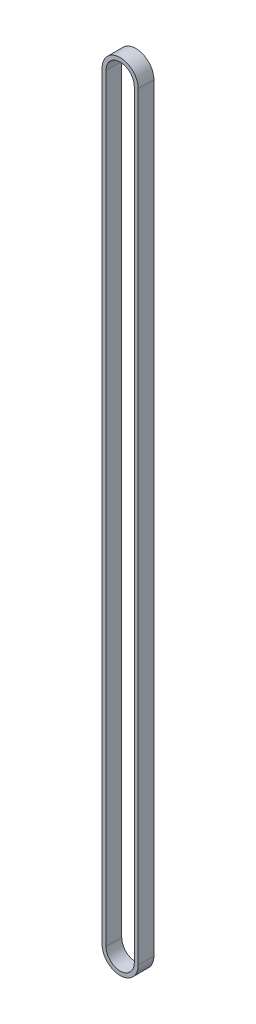
ISO-10303-21;
HEADER;
FILE_DESCRIPTION(('STEP AP214'),'2;1');
FILE_NAME('part.step','',(''),(''),'','','');
FILE_SCHEMA(('AUTOMOTIVE_DESIGN { 1 0 10303 214 1 1 1 1 }'));
ENDSEC;
DATA;
#1=APPLICATION_CONTEXT('core data for automotive mechanical design processes');
#2=APPLICATION_PROTOCOL_DEFINITION('international standard','automotive_design',2000,#1);
#3=PRODUCT_CONTEXT('',#1,'mechanical');
#4=PRODUCT('Part','Part','',(#3));
#5=PRODUCT_RELATED_PRODUCT_CATEGORY('part','',(#4));
#6=PRODUCT_DEFINITION_FORMATION('','',#4);
#7=PRODUCT_DEFINITION_CONTEXT('part definition',#1,'design');
#8=PRODUCT_DEFINITION('design','',#6,#7);
#9=PRODUCT_DEFINITION_SHAPE('','',#8);
#10=(LENGTH_UNIT() NAMED_UNIT(*) SI_UNIT(.MILLI.,.METRE.));
#11=(NAMED_UNIT(*) PLANE_ANGLE_UNIT() SI_UNIT($,.RADIAN.));
#12=(NAMED_UNIT(*) SI_UNIT($,.STERADIAN.) SOLID_ANGLE_UNIT());
#13=UNCERTAINTY_MEASURE_WITH_UNIT(LENGTH_MEASURE(1.E-05),#10,'distance_accuracy_value','');
#14=(GEOMETRIC_REPRESENTATION_CONTEXT(3) GLOBAL_UNCERTAINTY_ASSIGNED_CONTEXT((#13)) GLOBAL_UNIT_ASSIGNED_CONTEXT((#10,
#11,#12)) REPRESENTATION_CONTEXT('',''));
#15=CARTESIAN_POINT('',(0.,0.,0.));
#16=DIRECTION('',(0.,0.,1.));
#17=DIRECTION('',(1.,0.,0.));
#18=AXIS2_PLACEMENT_3D('',#15,#16,#17);
#19=CARTESIAN_POINT('',(0.,145.,152.));
#20=DIRECTION('',(0.,0.,1.));
#21=DIRECTION('',(1.,0.,0.));
#22=AXIS2_PLACEMENT_3D('',#19,#20,#21);
#23=PLANE('',#22);
#24=CARTESIAN_POINT('',(0.,145.,152.));
#25=DIRECTION('',(0.,0.,1.));
#26=DIRECTION('',(1.,0.,0.));
#27=AXIS2_PLACEMENT_3D('',#24,#25,#26);
#28=CIRCLE('',#27,6.9);
#29=CARTESIAN_POINT('',(6.9,145.,152.));
#30=VERTEX_POINT('',#29);
#31=CARTESIAN_POINT('',(-6.9,145.,152.));
#32=VERTEX_POINT('',#31);
#33=EDGE_CURVE('E118',#30,#32,#28,.T.);
#34=ORIENTED_EDGE('',*,*,#33,.T.);
#35=DIRECTION('',(0.,-1.,0.));
#36=VECTOR('',#35,1.);
#37=CARTESIAN_POINT('',(-6.9,145.,152.));
#38=LINE('',#37,#36);
#39=CARTESIAN_POINT('',(-6.9,-145.,152.));
#40=VERTEX_POINT('',#39);
#41=EDGE_CURVE('E121',#32,#40,#38,.T.);
#42=ORIENTED_EDGE('',*,*,#41,.T.);
#43=CARTESIAN_POINT('',(0.,-145.,152.));
#44=DIRECTION('',(0.,0.,1.));
#45=DIRECTION('',(1.,0.,0.));
#46=AXIS2_PLACEMENT_3D('',#43,#44,#45);
#47=CIRCLE('',#46,6.9);
#48=CARTESIAN_POINT('',(6.9,-145.,152.));
#49=VERTEX_POINT('',#48);
#50=EDGE_CURVE('E124',#40,#49,#47,.T.);
#51=ORIENTED_EDGE('',*,*,#50,.T.);
#52=DIRECTION('',(0.,1.,0.));
#53=VECTOR('',#52,1.);
#54=CARTESIAN_POINT('',(6.9,145.,152.));
#55=LINE('',#54,#53);
#56=EDGE_CURVE('E126',#49,#30,#55,.T.);
#57=ORIENTED_EDGE('',*,*,#56,.T.);
#58=EDGE_LOOP('',(#34,#42,#51,#57));
#59=FACE_BOUND('',#58,.T.);
#60=DIRECTION('',(0.,-1.,0.));
#61=VECTOR('',#60,1.);
#62=CARTESIAN_POINT('',(-5.4,145.,152.));
#63=LINE('',#62,#61);
#64=CARTESIAN_POINT('',(-5.4,145.,152.));
#65=VERTEX_POINT('',#64);
#66=CARTESIAN_POINT('',(-5.40000000000006,-145.,152.));
#67=VERTEX_POINT('',#66);
#68=EDGE_CURVE('E90',#65,#67,#63,.T.);
#69=ORIENTED_EDGE('',*,*,#68,.F.);
#70=CARTESIAN_POINT('',(0.,145.,152.));
#71=DIRECTION('',(0.,0.,1.));
#72=DIRECTION('',(1.,0.,0.));
#73=AXIS2_PLACEMENT_3D('',#70,#71,#72);
#74=CIRCLE('',#73,5.4);
#75=CARTESIAN_POINT('',(5.4,145.,152.));
#76=VERTEX_POINT('',#75);
#77=EDGE_CURVE('E82',#76,#65,#74,.T.);
#78=ORIENTED_EDGE('',*,*,#77,.F.);
#79=DIRECTION('',(0.,1.,0.));
#80=VECTOR('',#79,1.);
#81=CARTESIAN_POINT('',(5.4,145.,152.));
#82=LINE('',#81,#80);
#83=CARTESIAN_POINT('',(5.4,-145.,152.));
#84=VERTEX_POINT('',#83);
#85=EDGE_CURVE('E104',#84,#76,#82,.T.);
#86=ORIENTED_EDGE('',*,*,#85,.F.);
#87=CARTESIAN_POINT('',(0.,-145.,152.));
#88=DIRECTION('',(0.,0.,1.));
#89=DIRECTION('',(1.,0.,0.));
#90=AXIS2_PLACEMENT_3D('',#87,#88,#89);
#91=CIRCLE('',#90,5.4);
#92=EDGE_CURVE('E102',#67,#84,#91,.T.);
#93=ORIENTED_EDGE('',*,*,#92,.F.);
#94=EDGE_LOOP('',(#69,#78,#86,#93));
#95=FACE_BOUND('',#94,.T.);
#96=ADVANCED_FACE('F17',(#59,#95),#23,.T.);
#97=CARTESIAN_POINT('',(0.,145.,146.));
#98=DIRECTION('',(0.,0.,1.));
#99=DIRECTION('',(1.,0.,0.));
#100=AXIS2_PLACEMENT_3D('',#97,#98,#99);
#101=PLANE('',#100);
#102=CARTESIAN_POINT('',(0.,145.,146.));
#103=DIRECTION('',(0.,0.,1.));
#104=DIRECTION('',(1.,0.,0.));
#105=AXIS2_PLACEMENT_3D('',#102,#103,#104);
#106=CIRCLE('',#105,6.9);
#107=CARTESIAN_POINT('',(6.9,145.,146.));
#108=VERTEX_POINT('',#107);
#109=CARTESIAN_POINT('',(-6.9,145.,146.));
#110=VERTEX_POINT('',#109);
#111=EDGE_CURVE('E98',#108,#110,#106,.T.);
#112=ORIENTED_EDGE('',*,*,#111,.F.);
#113=DIRECTION('',(0.,1.,0.));
#114=VECTOR('',#113,1.);
#115=CARTESIAN_POINT('',(6.9,145.,146.));
#116=LINE('',#115,#114);
#117=CARTESIAN_POINT('',(6.9,-145.,146.));
#118=VERTEX_POINT('',#117);
#119=EDGE_CURVE('E122',#118,#108,#116,.T.);
#120=ORIENTED_EDGE('',*,*,#119,.F.);
#121=CARTESIAN_POINT('',(0.,-145.,146.));
#122=DIRECTION('',(0.,0.,1.));
#123=DIRECTION('',(1.,0.,0.));
#124=AXIS2_PLACEMENT_3D('',#121,#122,#123);
#125=CIRCLE('',#124,6.9);
#126=CARTESIAN_POINT('',(-6.9,-145.,146.));
#127=VERTEX_POINT('',#126);
#128=EDGE_CURVE('E133',#127,#118,#125,.T.);
#129=ORIENTED_EDGE('',*,*,#128,.F.);
#130=DIRECTION('',(0.,-1.,0.));
#131=VECTOR('',#130,1.);
#132=CARTESIAN_POINT('',(-6.9,145.,146.));
#133=LINE('',#132,#131);
#134=EDGE_CURVE('E131',#110,#127,#133,.T.);
#135=ORIENTED_EDGE('',*,*,#134,.F.);
#136=EDGE_LOOP('',(#112,#120,#129,#135));
#137=FACE_BOUND('',#136,.T.);
#138=CARTESIAN_POINT('',(0.,145.,146.));
#139=DIRECTION('',(0.,0.,1.));
#140=DIRECTION('',(1.,0.,0.));
#141=AXIS2_PLACEMENT_3D('',#138,#139,#140);
#142=CIRCLE('',#141,5.4);
#143=CARTESIAN_POINT('',(5.4,145.,146.));
#144=VERTEX_POINT('',#143);
#145=CARTESIAN_POINT('',(-5.4,145.,146.));
#146=VERTEX_POINT('',#145);
#147=EDGE_CURVE('E40',#144,#146,#142,.T.);
#148=ORIENTED_EDGE('',*,*,#147,.T.);
#149=DIRECTION('',(0.,-1.,0.));
#150=VECTOR('',#149,1.);
#151=CARTESIAN_POINT('',(-5.4,145.,146.));
#152=LINE('',#151,#150);
#153=CARTESIAN_POINT('',(-5.40000000000006,-145.,146.));
#154=VERTEX_POINT('',#153);
#155=EDGE_CURVE('E97',#146,#154,#152,.T.);
#156=ORIENTED_EDGE('',*,*,#155,.T.);
#157=CARTESIAN_POINT('',(0.,-145.,146.));
#158=DIRECTION('',(0.,0.,1.));
#159=DIRECTION('',(1.,0.,0.));
#160=AXIS2_PLACEMENT_3D('',#157,#158,#159);
#161=CIRCLE('',#160,5.4);
#162=CARTESIAN_POINT('',(5.4,-145.,146.));
#163=VERTEX_POINT('',#162);
#164=EDGE_CURVE('E110',#154,#163,#161,.T.);
#165=ORIENTED_EDGE('',*,*,#164,.T.);
#166=DIRECTION('',(0.,1.,0.));
#167=VECTOR('',#166,1.);
#168=CARTESIAN_POINT('',(5.4,145.,146.));
#169=LINE('',#168,#167);
#170=EDGE_CURVE('E91',#163,#144,#169,.T.);
#171=ORIENTED_EDGE('',*,*,#170,.T.);
#172=EDGE_LOOP('',(#148,#156,#165,#171));
#173=FACE_BOUND('',#172,.T.);
#174=ADVANCED_FACE('F151',(#137,#173),#101,.F.);
#175=CARTESIAN_POINT('',(0.,145.,152.));
#176=DIRECTION('',(0.,0.,-1.));
#177=DIRECTION('',(-1.,0.,0.));
#178=AXIS2_PLACEMENT_3D('',#175,#176,#177);
#179=CYLINDRICAL_SURFACE('',#178,6.9);
#180=ORIENTED_EDGE('',*,*,#111,.T.);
#181=DIRECTION('',(0.,0.,-1.));
#182=VECTOR('',#181,1.);
#183=CARTESIAN_POINT('',(-6.9,145.,152.));
#184=LINE('',#183,#182);
#185=EDGE_CURVE('E11',#32,#110,#184,.T.);
#186=ORIENTED_EDGE('',*,*,#185,.F.);
#187=ORIENTED_EDGE('',*,*,#33,.F.);
#188=DIRECTION('',(0.,0.,-1.));
#189=VECTOR('',#188,1.);
#190=CARTESIAN_POINT('',(6.9,145.,152.));
#191=LINE('',#190,#189);
#192=EDGE_CURVE('E128',#30,#108,#191,.T.);
#193=ORIENTED_EDGE('',*,*,#192,.T.);
#194=EDGE_LOOP('',(#180,#186,#187,#193));
#195=FACE_BOUND('',#194,.T.);
#196=ADVANCED_FACE('F19',(#195),#179,.T.);
#197=CARTESIAN_POINT('',(-6.9,145.,152.));
#198=DIRECTION('',(1.,0.,0.));
#199=DIRECTION('',(0.,1.,0.));
#200=AXIS2_PLACEMENT_3D('',#197,#198,#199);
#201=PLANE('',#200);
#202=ORIENTED_EDGE('',*,*,#134,.T.);
#203=DIRECTION('',(0.,0.,-1.));
#204=VECTOR('',#203,1.);
#205=CARTESIAN_POINT('',(-6.9,-145.,152.));
#206=LINE('',#205,#204);
#207=EDGE_CURVE('E25',#40,#127,#206,.T.);
#208=ORIENTED_EDGE('',*,*,#207,.F.);
#209=ORIENTED_EDGE('',*,*,#41,.F.);
#210=ORIENTED_EDGE('',*,*,#185,.T.);
#211=EDGE_LOOP('',(#202,#208,#209,#210));
#212=FACE_BOUND('',#211,.T.);
#213=ADVANCED_FACE('F161',(#212),#201,.F.);
#214=CARTESIAN_POINT('',(0.,-145.,152.));
#215=DIRECTION('',(0.,0.,-1.));
#216=DIRECTION('',(-1.,0.,0.));
#217=AXIS2_PLACEMENT_3D('',#214,#215,#216);
#218=CYLINDRICAL_SURFACE('',#217,6.9);
#219=ORIENTED_EDGE('',*,*,#128,.T.);
#220=DIRECTION('',(0.,0.,-1.));
#221=VECTOR('',#220,1.);
#222=CARTESIAN_POINT('',(6.9,-145.,152.));
#223=LINE('',#222,#221);
#224=EDGE_CURVE('E138',#49,#118,#223,.T.);
#225=ORIENTED_EDGE('',*,*,#224,.F.);
#226=ORIENTED_EDGE('',*,*,#50,.F.);
#227=ORIENTED_EDGE('',*,*,#207,.T.);
#228=EDGE_LOOP('',(#219,#225,#226,#227));
#229=FACE_BOUND('',#228,.T.);
#230=ADVANCED_FACE('F145',(#229),#218,.T.);
#231=CARTESIAN_POINT('',(6.9,145.,152.));
#232=DIRECTION('',(-1.,0.,0.));
#233=DIRECTION('',(0.,-1.,0.));
#234=AXIS2_PLACEMENT_3D('',#231,#232,#233);
#235=PLANE('',#234);
#236=ORIENTED_EDGE('',*,*,#119,.T.);
#237=ORIENTED_EDGE('',*,*,#192,.F.);
#238=ORIENTED_EDGE('',*,*,#56,.F.);
#239=ORIENTED_EDGE('',*,*,#224,.T.);
#240=EDGE_LOOP('',(#236,#237,#238,#239));
#241=FACE_BOUND('',#240,.T.);
#242=ADVANCED_FACE('F155',(#241),#235,.F.);
#243=CARTESIAN_POINT('',(0.,145.,152.));
#244=DIRECTION('',(0.,0.,-1.));
#245=DIRECTION('',(-1.,0.,0.));
#246=AXIS2_PLACEMENT_3D('',#243,#244,#245);
#247=CYLINDRICAL_SURFACE('',#246,5.4);
#248=ORIENTED_EDGE('',*,*,#147,.F.);
#249=DIRECTION('',(0.,0.,-1.));
#250=VECTOR('',#249,1.);
#251=CARTESIAN_POINT('',(5.4,145.,152.));
#252=LINE('',#251,#250);
#253=EDGE_CURVE('E86',#76,#144,#252,.T.);
#254=ORIENTED_EDGE('',*,*,#253,.F.);
#255=ORIENTED_EDGE('',*,*,#77,.T.);
#256=DIRECTION('',(0.,0.,-1.));
#257=VECTOR('',#256,1.);
#258=CARTESIAN_POINT('',(-5.4,145.,152.));
#259=LINE('',#258,#257);
#260=EDGE_CURVE('E85',#65,#146,#259,.T.);
#261=ORIENTED_EDGE('',*,*,#260,.T.);
#262=EDGE_LOOP('',(#248,#254,#255,#261));
#263=FACE_BOUND('',#262,.T.);
#264=ADVANCED_FACE('F84',(#263),#247,.F.);
#265=CARTESIAN_POINT('',(-5.4,145.,152.));
#266=DIRECTION('',(1.,0.,0.));
#267=DIRECTION('',(0.,1.,0.));
#268=AXIS2_PLACEMENT_3D('',#265,#266,#267);
#269=PLANE('',#268);
#270=ORIENTED_EDGE('',*,*,#155,.F.);
#271=ORIENTED_EDGE('',*,*,#260,.F.);
#272=ORIENTED_EDGE('',*,*,#68,.T.);
#273=DIRECTION('',(0.,0.,-1.));
#274=VECTOR('',#273,1.);
#275=CARTESIAN_POINT('',(-5.40000000000006,-145.,152.));
#276=LINE('',#275,#274);
#277=EDGE_CURVE('E99',#67,#154,#276,.T.);
#278=ORIENTED_EDGE('',*,*,#277,.T.);
#279=EDGE_LOOP('',(#270,#271,#272,#278));
#280=FACE_BOUND('',#279,.T.);
#281=ADVANCED_FACE('F94',(#280),#269,.T.);
#282=CARTESIAN_POINT('',(0.,-145.,152.));
#283=DIRECTION('',(0.,0.,-1.));
#284=DIRECTION('',(-1.,0.,0.));
#285=AXIS2_PLACEMENT_3D('',#282,#283,#284);
#286=CYLINDRICAL_SURFACE('',#285,5.4);
#287=ORIENTED_EDGE('',*,*,#164,.F.);
#288=ORIENTED_EDGE('',*,*,#277,.F.);
#289=ORIENTED_EDGE('',*,*,#92,.T.);
#290=DIRECTION('',(0.,0.,-1.));
#291=VECTOR('',#290,1.);
#292=CARTESIAN_POINT('',(5.4,-145.,152.));
#293=LINE('',#292,#291);
#294=EDGE_CURVE('E32',#84,#163,#293,.T.);
#295=ORIENTED_EDGE('',*,*,#294,.T.);
#296=EDGE_LOOP('',(#287,#288,#289,#295));
#297=FACE_BOUND('',#296,.T.);
#298=ADVANCED_FACE('F189',(#297),#286,.F.);
#299=CARTESIAN_POINT('',(5.4,145.,152.));
#300=DIRECTION('',(-1.,0.,0.));
#301=DIRECTION('',(0.,-1.,0.));
#302=AXIS2_PLACEMENT_3D('',#299,#300,#301);
#303=PLANE('',#302);
#304=ORIENTED_EDGE('',*,*,#170,.F.);
#305=ORIENTED_EDGE('',*,*,#294,.F.);
#306=ORIENTED_EDGE('',*,*,#85,.T.);
#307=ORIENTED_EDGE('',*,*,#253,.T.);
#308=EDGE_LOOP('',(#304,#305,#306,#307));
#309=FACE_BOUND('',#308,.T.);
#310=ADVANCED_FACE('F194',(#309),#303,.T.);
#311=CLOSED_SHELL('',(#96,#174,#196,#213,#230,#242,#264,#281,#298,#310));
#312=MANIFOLD_SOLID_BREP('B1',#311);
#313=ADVANCED_BREP_SHAPE_REPRESENTATION('',(#18,#312),#14);
#314=SHAPE_DEFINITION_REPRESENTATION(#9,#313);
ENDSEC;
END-ISO-10303-21;
